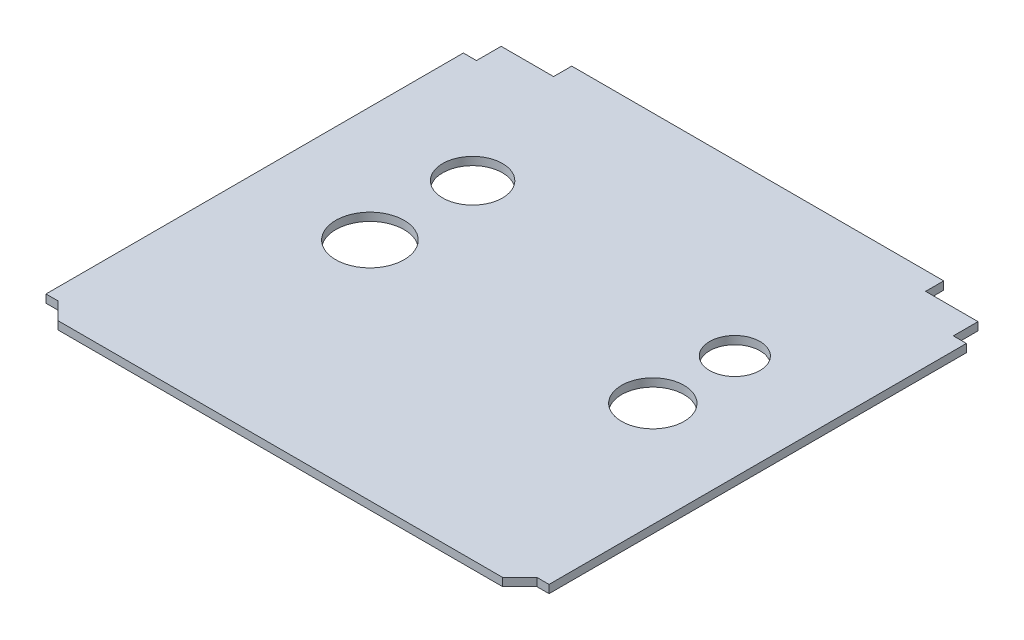
ISO-10303-21;
HEADER;
FILE_DESCRIPTION(('STEP AP214'),'2;1');
FILE_NAME('part.step','',(''),(''),'','','');
FILE_SCHEMA(('AUTOMOTIVE_DESIGN { 1 0 10303 214 1 1 1 1 }'));
ENDSEC;
DATA;
#1=APPLICATION_CONTEXT('core data for automotive mechanical design processes');
#2=APPLICATION_PROTOCOL_DEFINITION('international standard','automotive_design',2000,#1);
#3=PRODUCT_CONTEXT('',#1,'mechanical');
#4=PRODUCT('Part','Part','',(#3));
#5=PRODUCT_RELATED_PRODUCT_CATEGORY('part','',(#4));
#6=PRODUCT_DEFINITION_FORMATION('','',#4);
#7=PRODUCT_DEFINITION_CONTEXT('part definition',#1,'design');
#8=PRODUCT_DEFINITION('design','',#6,#7);
#9=PRODUCT_DEFINITION_SHAPE('','',#8);
#10=(LENGTH_UNIT() NAMED_UNIT(*) SI_UNIT(.MILLI.,.METRE.));
#11=(NAMED_UNIT(*) PLANE_ANGLE_UNIT() SI_UNIT($,.RADIAN.));
#12=(NAMED_UNIT(*) SI_UNIT($,.STERADIAN.) SOLID_ANGLE_UNIT());
#13=UNCERTAINTY_MEASURE_WITH_UNIT(LENGTH_MEASURE(1.E-05),#10,'distance_accuracy_value','');
#14=(GEOMETRIC_REPRESENTATION_CONTEXT(3) GLOBAL_UNCERTAINTY_ASSIGNED_CONTEXT((#13)) GLOBAL_UNIT_ASSIGNED_CONTEXT((#10,
#11,#12)) REPRESENTATION_CONTEXT('',''));
#15=CARTESIAN_POINT('',(0.,0.,0.));
#16=DIRECTION('',(0.,0.,1.));
#17=DIRECTION('',(1.,0.,0.));
#18=AXIS2_PLACEMENT_3D('',#15,#16,#17);
#19=CARTESIAN_POINT('',(0.,0.8,0.));
#20=DIRECTION('',(0.,1.,0.));
#21=DIRECTION('',(0.,0.,1.));
#22=AXIS2_PLACEMENT_3D('',#19,#20,#21);
#23=PLANE('',#22);
#24=CARTESIAN_POINT('',(29.0874355986546,0.8,0.));
#25=DIRECTION('',(0.,1.,0.));
#26=DIRECTION('',(0.,0.,1.));
#27=AXIS2_PLACEMENT_3D('',#24,#25,#26);
#28=CIRCLE('',#27,6.19979928564488);
#29=CARTESIAN_POINT('',(29.0874355986546,0.8,6.19979928564488));
#30=VERTEX_POINT('',#29);
#31=EDGE_CURVE('E162',#30,#30,#28,.T.);
#32=ORIENTED_EDGE('',*,*,#31,.F.);
#33=EDGE_LOOP('',(#32));
#34=FACE_BOUND('',#33,.T.);
#35=CARTESIAN_POINT('',(-27.03569099954,0.8,0.));
#36=DIRECTION('',(0.,1.,0.));
#37=DIRECTION('',(0.,0.,1.));
#38=AXIS2_PLACEMENT_3D('',#35,#36,#37);
#39=CIRCLE('',#38,6.77862356858633);
#40=CARTESIAN_POINT('',(-27.03569099954,0.8,6.77862356858633));
#41=VERTEX_POINT('',#40);
#42=EDGE_CURVE('E330',#41,#41,#39,.T.);
#43=ORIENTED_EDGE('',*,*,#42,.F.);
#44=EDGE_LOOP('',(#43));
#45=FACE_BOUND('',#44,.T.);
#46=CARTESIAN_POINT('',(-27.03569099954,0.8,-20.3696324944502));
#47=DIRECTION('',(0.,1.,0.));
#48=DIRECTION('',(0.,0.,1.));
#49=AXIS2_PLACEMENT_3D('',#46,#47,#48);
#50=CIRCLE('',#49,5.92686159109235);
#51=CARTESIAN_POINT('',(-27.03569099954,0.8,-14.4427709033579));
#52=VERTEX_POINT('',#51);
#53=EDGE_CURVE('E333',#52,#52,#50,.T.);
#54=ORIENTED_EDGE('',*,*,#53,.F.);
#55=EDGE_LOOP('',(#54));
#56=FACE_BOUND('',#55,.T.);
#57=CARTESIAN_POINT('',(29.0874355986546,0.8,-16.2682015008073));
#58=DIRECTION('',(0.,1.,0.));
#59=DIRECTION('',(0.,0.,1.));
#60=AXIS2_PLACEMENT_3D('',#57,#58,#59);
#61=CIRCLE('',#60,4.9941389586954);
#62=CARTESIAN_POINT('',(29.0874355986546,0.8,-11.2740625421119));
#63=VERTEX_POINT('',#62);
#64=EDGE_CURVE('E336',#63,#63,#61,.T.);
#65=ORIENTED_EDGE('',*,*,#64,.F.);
#66=EDGE_LOOP('',(#65));
#67=FACE_BOUND('',#66,.T.);
#68=DIRECTION('',(0.707106781186553,0.,0.707106781186542));
#69=VECTOR('',#68,1.);
#70=CARTESIAN_POINT('',(-44.4499999999997,0.8,44.4500000000004));
#71=LINE('',#70,#69);
#72=CARTESIAN_POINT('',(-47.5000000000001,0.8,41.4));
#73=VERTEX_POINT('',#72);
#74=CARTESIAN_POINT('',(-44.1000000000001,0.8,44.8));
#75=VERTEX_POINT('',#74);
#76=EDGE_CURVE('E44',#73,#75,#71,.T.);
#77=ORIENTED_EDGE('',*,*,#76,.T.);
#78=DIRECTION('',(1.,0.,0.));
#79=VECTOR('',#78,1.);
#80=CARTESIAN_POINT('',(0.,0.8,44.8));
#81=LINE('',#80,#79);
#82=CARTESIAN_POINT('',(44.0999999999991,0.8,44.8));
#83=VERTEX_POINT('',#82);
#84=EDGE_CURVE('E150',#75,#83,#81,.T.);
#85=ORIENTED_EDGE('',*,*,#84,.T.);
#86=DIRECTION('',(0.707106781186548,0.,-0.707106781186548));
#87=VECTOR('',#86,1.);
#88=CARTESIAN_POINT('',(44.4499999999995,0.8,44.4499999999995));
#89=LINE('',#88,#87);
#90=CARTESIAN_POINT('',(47.4999999999995,0.8,41.3999999999996));
#91=VERTEX_POINT('',#90);
#92=EDGE_CURVE('E11',#83,#91,#89,.T.);
#93=ORIENTED_EDGE('',*,*,#92,.T.);
#94=DIRECTION('',(1.,0.,1.96601993943993E-13));
#95=VECTOR('',#94,1.);
#96=CARTESIAN_POINT('',(-8.13932254928318E-12,0.8,41.3999999999902));
#97=LINE('',#96,#95);
#98=CARTESIAN_POINT('',(49.9000000000001,0.8,41.4));
#99=VERTEX_POINT('',#98);
#100=EDGE_CURVE('E172',#91,#99,#97,.T.);
#101=ORIENTED_EDGE('',*,*,#100,.T.);
#102=DIRECTION('',(0.,0.,-1.));
#103=VECTOR('',#102,1.);
#104=CARTESIAN_POINT('',(49.9000000000001,0.8,0.));
#105=LINE('',#104,#103);
#106=CARTESIAN_POINT('',(49.9000000000001,0.8,-41.4000000000031));
#107=VERTEX_POINT('',#106);
#108=EDGE_CURVE('E178',#99,#107,#105,.T.);
#109=ORIENTED_EDGE('',*,*,#108,.T.);
#110=DIRECTION('',(-1.,0.,0.));
#111=VECTOR('',#110,1.);
#112=CARTESIAN_POINT('',(0.,0.8,-41.4000000000031));
#113=LINE('',#112,#111);
#114=CARTESIAN_POINT('',(47.2999999999999,0.8,-41.4000000000031));
#115=VERTEX_POINT('',#114);
#116=EDGE_CURVE('E183',#107,#115,#113,.T.);
#117=ORIENTED_EDGE('',*,*,#116,.T.);
#118=DIRECTION('',(0.,0.,-1.));
#119=VECTOR('',#118,1.);
#120=CARTESIAN_POINT('',(47.2999999999999,0.8,0.));
#121=LINE('',#120,#119);
#122=CARTESIAN_POINT('',(47.2999999999999,0.8,-46.3));
#123=VERTEX_POINT('',#122);
#124=EDGE_CURVE('E304',#115,#123,#121,.T.);
#125=ORIENTED_EDGE('',*,*,#124,.T.);
#126=DIRECTION('',(-1.,0.,0.));
#127=VECTOR('',#126,1.);
#128=CARTESIAN_POINT('',(0.,0.8,-46.3));
#129=LINE('',#128,#127);
#130=CARTESIAN_POINT('',(36.8999999999997,0.8,-46.3));
#131=VERTEX_POINT('',#130);
#132=EDGE_CURVE('E298',#123,#131,#129,.T.);
#133=ORIENTED_EDGE('',*,*,#132,.T.);
#134=DIRECTION('',(0.,0.,-1.));
#135=VECTOR('',#134,1.);
#136=CARTESIAN_POINT('',(36.8999999999973,0.8,1.92033888790633E-12));
#137=LINE('',#136,#135);
#138=CARTESIAN_POINT('',(36.8999999999999,0.8,-49.9));
#139=VERTEX_POINT('',#138);
#140=EDGE_CURVE('E292',#131,#139,#137,.T.);
#141=ORIENTED_EDGE('',*,*,#140,.T.);
#142=DIRECTION('',(-1.,0.,0.));
#143=VECTOR('',#142,1.);
#144=CARTESIAN_POINT('',(0.,0.8,-49.9));
#145=LINE('',#144,#143);
#146=CARTESIAN_POINT('',(-36.9000000000002,0.8,-49.9));
#147=VERTEX_POINT('',#146);
#148=EDGE_CURVE('E283',#139,#147,#145,.T.);
#149=ORIENTED_EDGE('',*,*,#148,.T.);
#150=DIRECTION('',(0.,0.,1.));
#151=VECTOR('',#150,1.);
#152=CARTESIAN_POINT('',(-36.8999999999999,0.8,2.13370987545147E-13));
#153=LINE('',#152,#151);
#154=CARTESIAN_POINT('',(-36.9000000000002,0.8,-46.3));
#155=VERTEX_POINT('',#154);
#156=EDGE_CURVE('E277',#147,#155,#153,.T.);
#157=ORIENTED_EDGE('',*,*,#156,.T.);
#158=DIRECTION('',(-1.,0.,0.));
#159=VECTOR('',#158,1.);
#160=CARTESIAN_POINT('',(0.,0.8,-46.3));
#161=LINE('',#160,#159);
#162=CARTESIAN_POINT('',(-47.3000000000002,0.8,-46.3));
#163=VERTEX_POINT('',#162);
#164=EDGE_CURVE('E271',#155,#163,#161,.T.);
#165=ORIENTED_EDGE('',*,*,#164,.T.);
#166=DIRECTION('',(0.,0.,1.));
#167=VECTOR('',#166,1.);
#168=CARTESIAN_POINT('',(-47.3000000000002,0.8,0.));
#169=LINE('',#168,#167);
#170=CARTESIAN_POINT('',(-47.3000000000002,0.8,-41.4));
#171=VERTEX_POINT('',#170);
#172=EDGE_CURVE('E262',#163,#171,#169,.T.);
#173=ORIENTED_EDGE('',*,*,#172,.T.);
#174=DIRECTION('',(-1.,0.,0.));
#175=VECTOR('',#174,1.);
#176=CARTESIAN_POINT('',(1.10501885419723E-12,0.8,-41.3999999999987));
#177=LINE('',#176,#175);
#178=CARTESIAN_POINT('',(-49.9000000000001,0.8,-41.4000000000001));
#179=VERTEX_POINT('',#178);
#180=EDGE_CURVE('E256',#171,#179,#177,.T.);
#181=ORIENTED_EDGE('',*,*,#180,.T.);
#182=DIRECTION('',(0.,0.,1.));
#183=VECTOR('',#182,1.);
#184=CARTESIAN_POINT('',(-49.9000000000001,0.8,0.));
#185=LINE('',#184,#183);
#186=CARTESIAN_POINT('',(-49.9000000000001,0.8,41.4));
#187=VERTEX_POINT('',#186);
#188=EDGE_CURVE('E250',#179,#187,#185,.T.);
#189=ORIENTED_EDGE('',*,*,#188,.T.);
#190=DIRECTION('',(1.,0.,0.));
#191=VECTOR('',#190,1.);
#192=CARTESIAN_POINT('',(0.,0.8,41.4));
#193=LINE('',#192,#191);
#194=EDGE_CURVE('E324',#187,#73,#193,.T.);
#195=ORIENTED_EDGE('',*,*,#194,.T.);
#196=EDGE_LOOP('',(#77,#85,#93,#101,#109,#117,#125,#133,#141,#149,#157,#165,#173,#181,#189,#195));
#197=FACE_BOUND('',#196,.T.);
#198=ADVANCED_FACE('F35',(#34,#45,#56,#67,#197),#23,.T.);
#199=CARTESIAN_POINT('',(0.,-0.8,0.));
#200=DIRECTION('',(0.,1.,0.));
#201=DIRECTION('',(0.,0.,1.));
#202=AXIS2_PLACEMENT_3D('',#199,#200,#201);
#203=PLANE('',#202);
#204=CARTESIAN_POINT('',(29.0874355986546,-0.8,0.));
#205=DIRECTION('',(0.,1.,0.));
#206=DIRECTION('',(0.,0.,1.));
#207=AXIS2_PLACEMENT_3D('',#204,#205,#206);
#208=CIRCLE('',#207,6.19979928564488);
#209=CARTESIAN_POINT('',(29.0874355986546,-0.8,6.19979928564488));
#210=VERTEX_POINT('',#209);
#211=EDGE_CURVE('E343',#210,#210,#208,.T.);
#212=ORIENTED_EDGE('',*,*,#211,.T.);
#213=EDGE_LOOP('',(#212));
#214=FACE_BOUND('',#213,.T.);
#215=CARTESIAN_POINT('',(-27.03569099954,-0.8,0.));
#216=DIRECTION('',(0.,1.,0.));
#217=DIRECTION('',(0.,0.,1.));
#218=AXIS2_PLACEMENT_3D('',#215,#216,#217);
#219=CIRCLE('',#218,6.77862356858633);
#220=CARTESIAN_POINT('',(-27.03569099954,-0.8,6.77862356858633));
#221=VERTEX_POINT('',#220);
#222=EDGE_CURVE('E346',#221,#221,#219,.T.);
#223=ORIENTED_EDGE('',*,*,#222,.T.);
#224=EDGE_LOOP('',(#223));
#225=FACE_BOUND('',#224,.T.);
#226=CARTESIAN_POINT('',(-27.03569099954,-0.8,-20.3696324944502));
#227=DIRECTION('',(0.,1.,0.));
#228=DIRECTION('',(0.,0.,1.));
#229=AXIS2_PLACEMENT_3D('',#226,#227,#228);
#230=CIRCLE('',#229,5.92686159109235);
#231=CARTESIAN_POINT('',(-27.03569099954,-0.8,-14.4427709033579));
#232=VERTEX_POINT('',#231);
#233=EDGE_CURVE('E342',#232,#232,#230,.T.);
#234=ORIENTED_EDGE('',*,*,#233,.T.);
#235=EDGE_LOOP('',(#234));
#236=FACE_BOUND('',#235,.T.);
#237=CARTESIAN_POINT('',(29.0874355986546,-0.8,-16.2682015008073));
#238=DIRECTION('',(0.,1.,0.));
#239=DIRECTION('',(0.,0.,1.));
#240=AXIS2_PLACEMENT_3D('',#237,#238,#239);
#241=CIRCLE('',#240,4.9941389586954);
#242=CARTESIAN_POINT('',(29.0874355986546,-0.8,-11.2740625421119));
#243=VERTEX_POINT('',#242);
#244=EDGE_CURVE('E339',#243,#243,#241,.T.);
#245=ORIENTED_EDGE('',*,*,#244,.T.);
#246=EDGE_LOOP('',(#245));
#247=FACE_BOUND('',#246,.T.);
#248=DIRECTION('',(1.,0.,0.));
#249=VECTOR('',#248,1.);
#250=CARTESIAN_POINT('',(0.,-0.8,44.8));
#251=LINE('',#250,#249);
#252=CARTESIAN_POINT('',(-44.1000000000001,-0.8,44.8));
#253=VERTEX_POINT('',#252);
#254=CARTESIAN_POINT('',(44.0999999999991,-0.8,44.8));
#255=VERTEX_POINT('',#254);
#256=EDGE_CURVE('E52',#253,#255,#251,.T.);
#257=ORIENTED_EDGE('',*,*,#256,.F.);
#258=DIRECTION('',(0.707106781186553,0.,0.707106781186542));
#259=VECTOR('',#258,1.);
#260=CARTESIAN_POINT('',(-44.4499999999997,-0.8,44.4500000000004));
#261=LINE('',#260,#259);
#262=CARTESIAN_POINT('',(-47.5000000000001,-0.8,41.4));
#263=VERTEX_POINT('',#262);
#264=EDGE_CURVE('E59',#263,#253,#261,.T.);
#265=ORIENTED_EDGE('',*,*,#264,.F.);
#266=DIRECTION('',(1.,0.,0.));
#267=VECTOR('',#266,1.);
#268=CARTESIAN_POINT('',(0.,-0.8,41.4));
#269=LINE('',#268,#267);
#270=CARTESIAN_POINT('',(-49.9000000000001,-0.8,41.4));
#271=VERTEX_POINT('',#270);
#272=EDGE_CURVE('E177',#271,#263,#269,.T.);
#273=ORIENTED_EDGE('',*,*,#272,.F.);
#274=DIRECTION('',(0.,0.,1.));
#275=VECTOR('',#274,1.);
#276=CARTESIAN_POINT('',(-49.9000000000001,-0.8,0.));
#277=LINE('',#276,#275);
#278=CARTESIAN_POINT('',(-49.9000000000001,-0.8,-41.4000000000001));
#279=VERTEX_POINT('',#278);
#280=EDGE_CURVE('E181',#279,#271,#277,.T.);
#281=ORIENTED_EDGE('',*,*,#280,.F.);
#282=DIRECTION('',(-1.,0.,0.));
#283=VECTOR('',#282,1.);
#284=CARTESIAN_POINT('',(1.10501885419723E-12,-0.8,-41.3999999999987));
#285=LINE('',#284,#283);
#286=CARTESIAN_POINT('',(-47.3000000000002,-0.8,-41.4));
#287=VERTEX_POINT('',#286);
#288=EDGE_CURVE('E188',#287,#279,#285,.T.);
#289=ORIENTED_EDGE('',*,*,#288,.F.);
#290=DIRECTION('',(0.,0.,1.));
#291=VECTOR('',#290,1.);
#292=CARTESIAN_POINT('',(-47.3000000000002,-0.8,0.));
#293=LINE('',#292,#291);
#294=CARTESIAN_POINT('',(-47.3000000000002,-0.8,-46.3));
#295=VERTEX_POINT('',#294);
#296=EDGE_CURVE('E190',#295,#287,#293,.T.);
#297=ORIENTED_EDGE('',*,*,#296,.F.);
#298=DIRECTION('',(-1.,0.,0.));
#299=VECTOR('',#298,1.);
#300=CARTESIAN_POINT('',(0.,-0.8,-46.3));
#301=LINE('',#300,#299);
#302=CARTESIAN_POINT('',(-36.9000000000002,-0.8,-46.3));
#303=VERTEX_POINT('',#302);
#304=EDGE_CURVE('E192',#303,#295,#301,.T.);
#305=ORIENTED_EDGE('',*,*,#304,.F.);
#306=DIRECTION('',(0.,0.,1.));
#307=VECTOR('',#306,1.);
#308=CARTESIAN_POINT('',(-36.8999999999999,-0.8,2.13370987545147E-13));
#309=LINE('',#308,#307);
#310=CARTESIAN_POINT('',(-36.9000000000002,-0.8,-49.9));
#311=VERTEX_POINT('',#310);
#312=EDGE_CURVE('E194',#311,#303,#309,.T.);
#313=ORIENTED_EDGE('',*,*,#312,.F.);
#314=DIRECTION('',(-1.,0.,0.));
#315=VECTOR('',#314,1.);
#316=CARTESIAN_POINT('',(0.,-0.8,-49.9));
#317=LINE('',#316,#315);
#318=CARTESIAN_POINT('',(36.8999999999999,-0.8,-49.9));
#319=VERTEX_POINT('',#318);
#320=EDGE_CURVE('E196',#319,#311,#317,.T.);
#321=ORIENTED_EDGE('',*,*,#320,.F.);
#322=DIRECTION('',(0.,0.,-1.));
#323=VECTOR('',#322,1.);
#324=CARTESIAN_POINT('',(36.8999999999973,-0.8,1.92033888790633E-12));
#325=LINE('',#324,#323);
#326=CARTESIAN_POINT('',(36.8999999999997,-0.8,-46.3));
#327=VERTEX_POINT('',#326);
#328=EDGE_CURVE('E198',#327,#319,#325,.T.);
#329=ORIENTED_EDGE('',*,*,#328,.F.);
#330=DIRECTION('',(-1.,0.,0.));
#331=VECTOR('',#330,1.);
#332=CARTESIAN_POINT('',(0.,-0.8,-46.3));
#333=LINE('',#332,#331);
#334=CARTESIAN_POINT('',(47.2999999999999,-0.8,-46.3));
#335=VERTEX_POINT('',#334);
#336=EDGE_CURVE('E200',#335,#327,#333,.T.);
#337=ORIENTED_EDGE('',*,*,#336,.F.);
#338=DIRECTION('',(0.,0.,-1.));
#339=VECTOR('',#338,1.);
#340=CARTESIAN_POINT('',(47.2999999999999,-0.8,0.));
#341=LINE('',#340,#339);
#342=CARTESIAN_POINT('',(47.2999999999999,-0.8,-41.4000000000031));
#343=VERTEX_POINT('',#342);
#344=EDGE_CURVE('E202',#343,#335,#341,.T.);
#345=ORIENTED_EDGE('',*,*,#344,.F.);
#346=DIRECTION('',(-1.,0.,0.));
#347=VECTOR('',#346,1.);
#348=CARTESIAN_POINT('',(0.,-0.8,-41.4000000000031));
#349=LINE('',#348,#347);
#350=CARTESIAN_POINT('',(49.9000000000001,-0.8,-41.4000000000031));
#351=VERTEX_POINT('',#350);
#352=EDGE_CURVE('E204',#351,#343,#349,.T.);
#353=ORIENTED_EDGE('',*,*,#352,.F.);
#354=DIRECTION('',(0.,0.,-1.));
#355=VECTOR('',#354,1.);
#356=CARTESIAN_POINT('',(49.9000000000001,-0.8,0.));
#357=LINE('',#356,#355);
#358=CARTESIAN_POINT('',(49.9000000000001,-0.8,41.4));
#359=VERTEX_POINT('',#358);
#360=EDGE_CURVE('E206',#359,#351,#357,.T.);
#361=ORIENTED_EDGE('',*,*,#360,.F.);
#362=DIRECTION('',(1.,0.,1.96601993943993E-13));
#363=VECTOR('',#362,1.);
#364=CARTESIAN_POINT('',(-8.13932254928318E-12,-0.8,41.3999999999902));
#365=LINE('',#364,#363);
#366=CARTESIAN_POINT('',(47.4999999999995,-0.8,41.3999999999996));
#367=VERTEX_POINT('',#366);
#368=EDGE_CURVE('E208',#367,#359,#365,.T.);
#369=ORIENTED_EDGE('',*,*,#368,.F.);
#370=DIRECTION('',(0.707106781186548,0.,-0.707106781186548));
#371=VECTOR('',#370,1.);
#372=CARTESIAN_POINT('',(44.4499999999995,-0.8,44.4499999999995));
#373=LINE('',#372,#371);
#374=EDGE_CURVE('E39',#255,#367,#373,.T.);
#375=ORIENTED_EDGE('',*,*,#374,.F.);
#376=EDGE_LOOP('',(#257,#265,#273,#281,#289,#297,#305,#313,#321,#329,#337,#345,#353,#361,#369,#375));
#377=FACE_BOUND('',#376,.T.);
#378=ADVANCED_FACE('F242',(#214,#225,#236,#247,#377),#203,.F.);
#379=CARTESIAN_POINT('',(-44.4499999999997,0.8,44.4500000000004));
#380=DIRECTION('',(0.707106781186542,0.,-0.707106781186553));
#381=DIRECTION('',(-0.707106781186553,0.,-0.707106781186542));
#382=AXIS2_PLACEMENT_3D('',#379,#380,#381);
#383=PLANE('',#382);
#384=DIRECTION('',(0.,1.,0.));
#385=VECTOR('',#384,1.);
#386=CARTESIAN_POINT('',(-44.1000000000001,-0.8,44.8));
#387=LINE('',#386,#385);
#388=EDGE_CURVE('E155',#253,#75,#387,.T.);
#389=ORIENTED_EDGE('',*,*,#388,.T.);
#390=ORIENTED_EDGE('',*,*,#76,.F.);
#391=DIRECTION('',(0.,1.,0.));
#392=VECTOR('',#391,1.);
#393=CARTESIAN_POINT('',(-47.5000000000001,-0.8,41.4));
#394=LINE('',#393,#392);
#395=EDGE_CURVE('E209',#263,#73,#394,.T.);
#396=ORIENTED_EDGE('',*,*,#395,.F.);
#397=ORIENTED_EDGE('',*,*,#264,.T.);
#398=EDGE_LOOP('',(#389,#390,#396,#397));
#399=FACE_BOUND('',#398,.T.);
#400=ADVANCED_FACE('F37',(#399),#383,.F.);
#401=CARTESIAN_POINT('',(44.4499999999995,0.8,44.4499999999995));
#402=DIRECTION('',(-0.707106781186548,0.,-0.707106781186548));
#403=DIRECTION('',(-0.707106781186548,0.,0.707106781186548));
#404=AXIS2_PLACEMENT_3D('',#401,#402,#403);
#405=PLANE('',#404);
#406=DIRECTION('',(0.,1.,0.));
#407=VECTOR('',#406,1.);
#408=CARTESIAN_POINT('',(44.0999999999991,-0.8,44.8));
#409=LINE('',#408,#407);
#410=EDGE_CURVE('E147',#255,#83,#409,.T.);
#411=ORIENTED_EDGE('',*,*,#410,.F.);
#412=ORIENTED_EDGE('',*,*,#374,.T.);
#413=DIRECTION('',(0.,1.,0.));
#414=VECTOR('',#413,1.);
#415=CARTESIAN_POINT('',(47.4999999999995,-0.8,41.3999999999996));
#416=LINE('',#415,#414);
#417=EDGE_CURVE('E166',#367,#91,#416,.T.);
#418=ORIENTED_EDGE('',*,*,#417,.T.);
#419=ORIENTED_EDGE('',*,*,#92,.F.);
#420=EDGE_LOOP('',(#411,#412,#418,#419));
#421=FACE_BOUND('',#420,.T.);
#422=ADVANCED_FACE('F164',(#421),#405,.F.);
#423=CARTESIAN_POINT('',(-8.13932254928318E-12,-0.8,41.3999999999902));
#424=DIRECTION('',(-1.96601993943993E-13,0.,1.));
#425=DIRECTION('',(1.,0.,1.96601993943993E-13));
#426=AXIS2_PLACEMENT_3D('',#423,#424,#425);
#427=PLANE('',#426);
#428=ORIENTED_EDGE('',*,*,#417,.F.);
#429=ORIENTED_EDGE('',*,*,#368,.T.);
#430=DIRECTION('',(0.,1.,0.));
#431=VECTOR('',#430,1.);
#432=CARTESIAN_POINT('',(49.9000000000001,-0.8,41.4));
#433=LINE('',#432,#431);
#434=EDGE_CURVE('E170',#359,#99,#433,.T.);
#435=ORIENTED_EDGE('',*,*,#434,.T.);
#436=ORIENTED_EDGE('',*,*,#100,.F.);
#437=EDGE_LOOP('',(#428,#429,#435,#436));
#438=FACE_BOUND('',#437,.T.);
#439=ADVANCED_FACE('F173',(#438),#427,.T.);
#440=CARTESIAN_POINT('',(49.9000000000001,-0.8,0.));
#441=DIRECTION('',(1.,0.,0.));
#442=DIRECTION('',(0.,0.,-1.));
#443=AXIS2_PLACEMENT_3D('',#440,#441,#442);
#444=PLANE('',#443);
#445=ORIENTED_EDGE('',*,*,#434,.F.);
#446=ORIENTED_EDGE('',*,*,#360,.T.);
#447=DIRECTION('',(0.,1.,0.));
#448=VECTOR('',#447,1.);
#449=CARTESIAN_POINT('',(49.9000000000001,-0.8,-41.4000000000031));
#450=LINE('',#449,#448);
#451=EDGE_CURVE('E212',#351,#107,#450,.T.);
#452=ORIENTED_EDGE('',*,*,#451,.T.);
#453=ORIENTED_EDGE('',*,*,#108,.F.);
#454=EDGE_LOOP('',(#445,#446,#452,#453));
#455=FACE_BOUND('',#454,.T.);
#456=ADVANCED_FACE('F313',(#455),#444,.T.);
#457=CARTESIAN_POINT('',(0.,-0.8,-41.4000000000031));
#458=DIRECTION('',(0.,0.,-1.));
#459=DIRECTION('',(-1.,0.,0.));
#460=AXIS2_PLACEMENT_3D('',#457,#458,#459);
#461=PLANE('',#460);
#462=ORIENTED_EDGE('',*,*,#451,.F.);
#463=ORIENTED_EDGE('',*,*,#352,.T.);
#464=DIRECTION('',(0.,1.,0.));
#465=VECTOR('',#464,1.);
#466=CARTESIAN_POINT('',(47.2999999999999,-0.8,-41.4000000000031));
#467=LINE('',#466,#465);
#468=EDGE_CURVE('E214',#343,#115,#467,.T.);
#469=ORIENTED_EDGE('',*,*,#468,.T.);
#470=ORIENTED_EDGE('',*,*,#116,.F.);
#471=EDGE_LOOP('',(#462,#463,#469,#470));
#472=FACE_BOUND('',#471,.T.);
#473=ADVANCED_FACE('F310',(#472),#461,.T.);
#474=CARTESIAN_POINT('',(47.2999999999999,-0.8,0.));
#475=DIRECTION('',(1.,0.,0.));
#476=DIRECTION('',(0.,0.,-1.));
#477=AXIS2_PLACEMENT_3D('',#474,#475,#476);
#478=PLANE('',#477);
#479=ORIENTED_EDGE('',*,*,#468,.F.);
#480=ORIENTED_EDGE('',*,*,#344,.T.);
#481=DIRECTION('',(0.,1.,0.));
#482=VECTOR('',#481,1.);
#483=CARTESIAN_POINT('',(47.2999999999999,-0.8,-46.3));
#484=LINE('',#483,#482);
#485=EDGE_CURVE('E216',#335,#123,#484,.T.);
#486=ORIENTED_EDGE('',*,*,#485,.T.);
#487=ORIENTED_EDGE('',*,*,#124,.F.);
#488=EDGE_LOOP('',(#479,#480,#486,#487));
#489=FACE_BOUND('',#488,.T.);
#490=ADVANCED_FACE('F303',(#489),#478,.T.);
#491=CARTESIAN_POINT('',(0.,-0.8,-46.3));
#492=DIRECTION('',(0.,0.,-1.));
#493=DIRECTION('',(-1.,0.,0.));
#494=AXIS2_PLACEMENT_3D('',#491,#492,#493);
#495=PLANE('',#494);
#496=ORIENTED_EDGE('',*,*,#485,.F.);
#497=ORIENTED_EDGE('',*,*,#336,.T.);
#498=DIRECTION('',(0.,1.,0.));
#499=VECTOR('',#498,1.);
#500=CARTESIAN_POINT('',(36.8999999999997,-0.8,-46.3));
#501=LINE('',#500,#499);
#502=EDGE_CURVE('E218',#327,#131,#501,.T.);
#503=ORIENTED_EDGE('',*,*,#502,.T.);
#504=ORIENTED_EDGE('',*,*,#132,.F.);
#505=EDGE_LOOP('',(#496,#497,#503,#504));
#506=FACE_BOUND('',#505,.T.);
#507=ADVANCED_FACE('F297',(#506),#495,.T.);
#508=CARTESIAN_POINT('',(36.8999999999973,-0.8,1.92033888790633E-12));
#509=DIRECTION('',(1.,0.,0.));
#510=DIRECTION('',(0.,0.,-1.));
#511=AXIS2_PLACEMENT_3D('',#508,#509,#510);
#512=PLANE('',#511);
#513=ORIENTED_EDGE('',*,*,#502,.F.);
#514=ORIENTED_EDGE('',*,*,#328,.T.);
#515=DIRECTION('',(0.,1.,0.));
#516=VECTOR('',#515,1.);
#517=CARTESIAN_POINT('',(36.8999999999999,-0.8,-49.9));
#518=LINE('',#517,#516);
#519=EDGE_CURVE('E220',#319,#139,#518,.T.);
#520=ORIENTED_EDGE('',*,*,#519,.T.);
#521=ORIENTED_EDGE('',*,*,#140,.F.);
#522=EDGE_LOOP('',(#513,#514,#520,#521));
#523=FACE_BOUND('',#522,.T.);
#524=ADVANCED_FACE('F290',(#523),#512,.T.);
#525=CARTESIAN_POINT('',(0.,-0.8,-49.9));
#526=DIRECTION('',(0.,0.,-1.));
#527=DIRECTION('',(-1.,0.,0.));
#528=AXIS2_PLACEMENT_3D('',#525,#526,#527);
#529=PLANE('',#528);
#530=ORIENTED_EDGE('',*,*,#519,.F.);
#531=ORIENTED_EDGE('',*,*,#320,.T.);
#532=DIRECTION('',(0.,1.,0.));
#533=VECTOR('',#532,1.);
#534=CARTESIAN_POINT('',(-36.9000000000002,-0.8,-49.9));
#535=LINE('',#534,#533);
#536=EDGE_CURVE('E222',#311,#147,#535,.T.);
#537=ORIENTED_EDGE('',*,*,#536,.T.);
#538=ORIENTED_EDGE('',*,*,#148,.F.);
#539=EDGE_LOOP('',(#530,#531,#537,#538));
#540=FACE_BOUND('',#539,.T.);
#541=ADVANCED_FACE('F282',(#540),#529,.T.);
#542=CARTESIAN_POINT('',(-36.8999999999999,-0.8,2.13370987545147E-13));
#543=DIRECTION('',(-1.,0.,0.));
#544=DIRECTION('',(0.,0.,1.));
#545=AXIS2_PLACEMENT_3D('',#542,#543,#544);
#546=PLANE('',#545);
#547=ORIENTED_EDGE('',*,*,#536,.F.);
#548=ORIENTED_EDGE('',*,*,#312,.T.);
#549=DIRECTION('',(0.,1.,0.));
#550=VECTOR('',#549,1.);
#551=CARTESIAN_POINT('',(-36.9000000000002,-0.8,-46.3));
#552=LINE('',#551,#550);
#553=EDGE_CURVE('E224',#303,#155,#552,.T.);
#554=ORIENTED_EDGE('',*,*,#553,.T.);
#555=ORIENTED_EDGE('',*,*,#156,.F.);
#556=EDGE_LOOP('',(#547,#548,#554,#555));
#557=FACE_BOUND('',#556,.T.);
#558=ADVANCED_FACE('F276',(#557),#546,.T.);
#559=CARTESIAN_POINT('',(0.,-0.8,-46.3));
#560=DIRECTION('',(0.,0.,-1.));
#561=DIRECTION('',(-1.,0.,0.));
#562=AXIS2_PLACEMENT_3D('',#559,#560,#561);
#563=PLANE('',#562);
#564=ORIENTED_EDGE('',*,*,#553,.F.);
#565=ORIENTED_EDGE('',*,*,#304,.T.);
#566=DIRECTION('',(0.,1.,0.));
#567=VECTOR('',#566,1.);
#568=CARTESIAN_POINT('',(-47.3000000000002,-0.8,-46.3));
#569=LINE('',#568,#567);
#570=EDGE_CURVE('E226',#295,#163,#569,.T.);
#571=ORIENTED_EDGE('',*,*,#570,.T.);
#572=ORIENTED_EDGE('',*,*,#164,.F.);
#573=EDGE_LOOP('',(#564,#565,#571,#572));
#574=FACE_BOUND('',#573,.T.);
#575=ADVANCED_FACE('F269',(#574),#563,.T.);
#576=CARTESIAN_POINT('',(-47.3000000000002,-0.8,0.));
#577=DIRECTION('',(-1.,0.,0.));
#578=DIRECTION('',(0.,0.,1.));
#579=AXIS2_PLACEMENT_3D('',#576,#577,#578);
#580=PLANE('',#579);
#581=ORIENTED_EDGE('',*,*,#570,.F.);
#582=ORIENTED_EDGE('',*,*,#296,.T.);
#583=DIRECTION('',(0.,1.,0.));
#584=VECTOR('',#583,1.);
#585=CARTESIAN_POINT('',(-47.3000000000002,-0.8,-41.4));
#586=LINE('',#585,#584);
#587=EDGE_CURVE('E228',#287,#171,#586,.T.);
#588=ORIENTED_EDGE('',*,*,#587,.T.);
#589=ORIENTED_EDGE('',*,*,#172,.F.);
#590=EDGE_LOOP('',(#581,#582,#588,#589));
#591=FACE_BOUND('',#590,.T.);
#592=ADVANCED_FACE('F261',(#591),#580,.T.);
#593=CARTESIAN_POINT('',(1.10501885419723E-12,-0.8,-41.3999999999987));
#594=DIRECTION('',(0.,0.,-1.));
#595=DIRECTION('',(-1.,0.,0.));
#596=AXIS2_PLACEMENT_3D('',#593,#594,#595);
#597=PLANE('',#596);
#598=ORIENTED_EDGE('',*,*,#587,.F.);
#599=ORIENTED_EDGE('',*,*,#288,.T.);
#600=DIRECTION('',(0.,1.,0.));
#601=VECTOR('',#600,1.);
#602=CARTESIAN_POINT('',(-49.9000000000001,-0.8,-41.4000000000001));
#603=LINE('',#602,#601);
#604=EDGE_CURVE('E230',#279,#179,#603,.T.);
#605=ORIENTED_EDGE('',*,*,#604,.T.);
#606=ORIENTED_EDGE('',*,*,#180,.F.);
#607=EDGE_LOOP('',(#598,#599,#605,#606));
#608=FACE_BOUND('',#607,.T.);
#609=ADVANCED_FACE('F255',(#608),#597,.T.);
#610=CARTESIAN_POINT('',(-49.9000000000001,-0.8,0.));
#611=DIRECTION('',(-1.,0.,0.));
#612=DIRECTION('',(0.,0.,1.));
#613=AXIS2_PLACEMENT_3D('',#610,#611,#612);
#614=PLANE('',#613);
#615=ORIENTED_EDGE('',*,*,#604,.F.);
#616=ORIENTED_EDGE('',*,*,#280,.T.);
#617=DIRECTION('',(0.,1.,0.));
#618=VECTOR('',#617,1.);
#619=CARTESIAN_POINT('',(-49.9000000000001,-0.8,41.4));
#620=LINE('',#619,#618);
#621=EDGE_CURVE('E232',#271,#187,#620,.T.);
#622=ORIENTED_EDGE('',*,*,#621,.T.);
#623=ORIENTED_EDGE('',*,*,#188,.F.);
#624=EDGE_LOOP('',(#615,#616,#622,#623));
#625=FACE_BOUND('',#624,.T.);
#626=ADVANCED_FACE('F247',(#625),#614,.T.);
#627=CARTESIAN_POINT('',(0.,-0.8,41.4));
#628=DIRECTION('',(0.,0.,1.));
#629=DIRECTION('',(1.,0.,0.));
#630=AXIS2_PLACEMENT_3D('',#627,#628,#629);
#631=PLANE('',#630);
#632=ORIENTED_EDGE('',*,*,#621,.F.);
#633=ORIENTED_EDGE('',*,*,#272,.T.);
#634=ORIENTED_EDGE('',*,*,#395,.T.);
#635=ORIENTED_EDGE('',*,*,#194,.F.);
#636=EDGE_LOOP('',(#632,#633,#634,#635));
#637=FACE_BOUND('',#636,.T.);
#638=ADVANCED_FACE('F240',(#637),#631,.T.);
#639=CARTESIAN_POINT('',(0.,-0.8,44.8));
#640=DIRECTION('',(0.,0.,1.));
#641=DIRECTION('',(1.,0.,0.));
#642=AXIS2_PLACEMENT_3D('',#639,#640,#641);
#643=PLANE('',#642);
#644=ORIENTED_EDGE('',*,*,#388,.F.);
#645=ORIENTED_EDGE('',*,*,#256,.T.);
#646=ORIENTED_EDGE('',*,*,#410,.T.);
#647=ORIENTED_EDGE('',*,*,#84,.F.);
#648=EDGE_LOOP('',(#644,#645,#646,#647));
#649=FACE_BOUND('',#648,.T.);
#650=ADVANCED_FACE('F149',(#649),#643,.T.);
#651=CARTESIAN_POINT('',(29.0874355986546,-0.8,-16.2682015008073));
#652=DIRECTION('',(0.,1.,0.));
#653=DIRECTION('',(0.,0.,1.));
#654=AXIS2_PLACEMENT_3D('',#651,#652,#653);
#655=CYLINDRICAL_SURFACE('',#654,4.9941389586954);
#656=ORIENTED_EDGE('',*,*,#64,.T.);
#657=EDGE_LOOP('',(#656));
#658=FACE_BOUND('',#657,.T.);
#659=ORIENTED_EDGE('',*,*,#244,.F.);
#660=EDGE_LOOP('',(#659));
#661=FACE_BOUND('',#660,.T.);
#662=ADVANCED_FACE('F357',(#658,#661),#655,.F.);
#663=CARTESIAN_POINT('',(-27.03569099954,-0.8,-20.3696324944502));
#664=DIRECTION('',(0.,1.,0.));
#665=DIRECTION('',(0.,0.,1.));
#666=AXIS2_PLACEMENT_3D('',#663,#664,#665);
#667=CYLINDRICAL_SURFACE('',#666,5.92686159109235);
#668=ORIENTED_EDGE('',*,*,#53,.T.);
#669=EDGE_LOOP('',(#668));
#670=FACE_BOUND('',#669,.T.);
#671=ORIENTED_EDGE('',*,*,#233,.F.);
#672=EDGE_LOOP('',(#671));
#673=FACE_BOUND('',#672,.T.);
#674=ADVANCED_FACE('F354',(#670,#673),#667,.F.);
#675=CARTESIAN_POINT('',(-27.03569099954,-0.8,0.));
#676=DIRECTION('',(0.,1.,0.));
#677=DIRECTION('',(0.,0.,1.));
#678=AXIS2_PLACEMENT_3D('',#675,#676,#677);
#679=CYLINDRICAL_SURFACE('',#678,6.77862356858633);
#680=ORIENTED_EDGE('',*,*,#42,.T.);
#681=EDGE_LOOP('',(#680));
#682=FACE_BOUND('',#681,.T.);
#683=ORIENTED_EDGE('',*,*,#222,.F.);
#684=EDGE_LOOP('',(#683));
#685=FACE_BOUND('',#684,.T.);
#686=ADVANCED_FACE('F356',(#682,#685),#679,.F.);
#687=CARTESIAN_POINT('',(29.0874355986546,-0.8,0.));
#688=DIRECTION('',(0.,1.,0.));
#689=DIRECTION('',(0.,0.,1.));
#690=AXIS2_PLACEMENT_3D('',#687,#688,#689);
#691=CYLINDRICAL_SURFACE('',#690,6.19979928564488);
#692=ORIENTED_EDGE('',*,*,#31,.T.);
#693=EDGE_LOOP('',(#692));
#694=FACE_BOUND('',#693,.T.);
#695=ORIENTED_EDGE('',*,*,#211,.F.);
#696=EDGE_LOOP('',(#695));
#697=FACE_BOUND('',#696,.T.);
#698=ADVANCED_FACE('F364',(#694,#697),#691,.F.);
#699=CLOSED_SHELL('',(#198,#378,#400,#422,#439,#456,#473,#490,#507,#524,#541,#558,#575,#592,
#609,#626,#638,#650,#662,#674,#686,#698));
#700=MANIFOLD_SOLID_BREP('B2',#699);
#701=ADVANCED_BREP_SHAPE_REPRESENTATION('',(#18,#700),#14);
#702=SHAPE_DEFINITION_REPRESENTATION(#9,#701);
ENDSEC;
END-ISO-10303-21;
